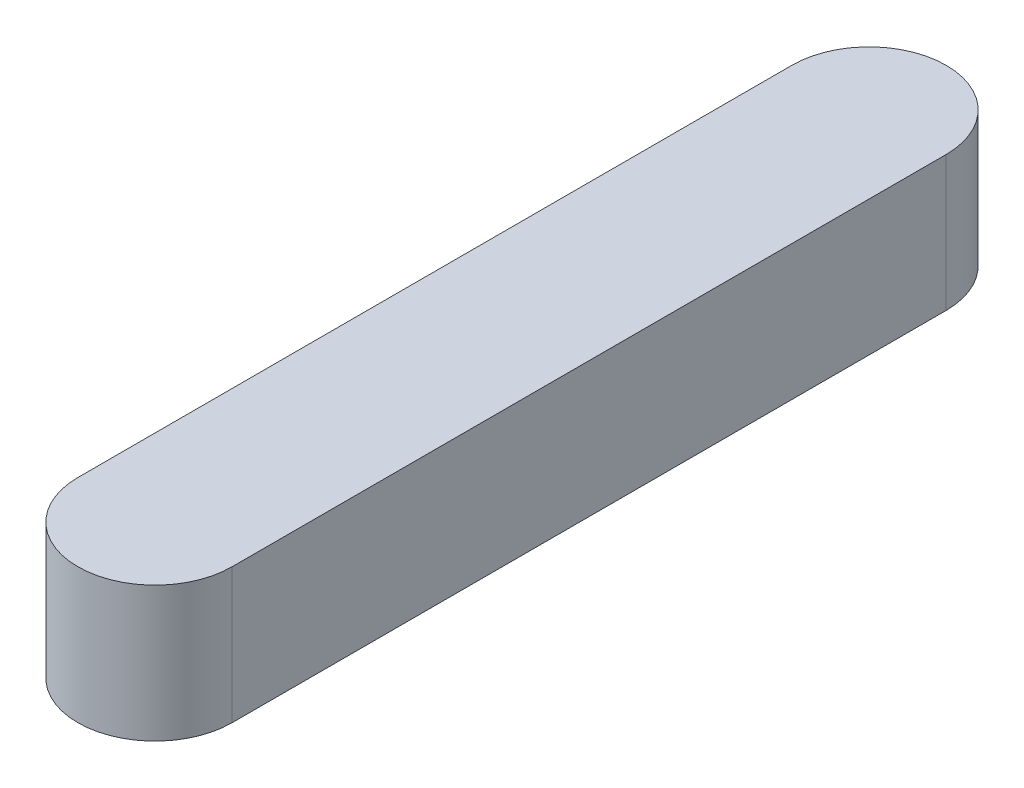
ISO-10303-21;
HEADER;
FILE_DESCRIPTION(('STEP AP214'),'2;1');
FILE_NAME('part.step','',(''),(''),'','','');
FILE_SCHEMA(('AUTOMOTIVE_DESIGN { 1 0 10303 214 1 1 1 1 }'));
ENDSEC;
DATA;
#1=APPLICATION_CONTEXT('core data for automotive mechanical design processes');
#2=APPLICATION_PROTOCOL_DEFINITION('international standard','automotive_design',2000,#1);
#3=PRODUCT_CONTEXT('',#1,'mechanical');
#4=PRODUCT('Part','Part','',(#3));
#5=PRODUCT_RELATED_PRODUCT_CATEGORY('part','',(#4));
#6=PRODUCT_DEFINITION_FORMATION('','',#4);
#7=PRODUCT_DEFINITION_CONTEXT('part definition',#1,'design');
#8=PRODUCT_DEFINITION('design','',#6,#7);
#9=PRODUCT_DEFINITION_SHAPE('','',#8);
#10=(LENGTH_UNIT() NAMED_UNIT(*) SI_UNIT(.MILLI.,.METRE.));
#11=(NAMED_UNIT(*) PLANE_ANGLE_UNIT() SI_UNIT($,.RADIAN.));
#12=(NAMED_UNIT(*) SI_UNIT($,.STERADIAN.) SOLID_ANGLE_UNIT());
#13=UNCERTAINTY_MEASURE_WITH_UNIT(LENGTH_MEASURE(1.E-05),#10,'distance_accuracy_value','');
#14=(GEOMETRIC_REPRESENTATION_CONTEXT(3) GLOBAL_UNCERTAINTY_ASSIGNED_CONTEXT((#13)) GLOBAL_UNIT_ASSIGNED_CONTEXT((#10,
#11,#12)) REPRESENTATION_CONTEXT('',''));
#15=CARTESIAN_POINT('',(0.,0.,0.));
#16=DIRECTION('',(0.,0.,1.));
#17=DIRECTION('',(1.,0.,0.));
#18=AXIS2_PLACEMENT_3D('',#15,#16,#17);
#19=CARTESIAN_POINT('',(0.,3.5,-18.5));
#20=DIRECTION('',(0.,-1.,0.));
#21=DIRECTION('',(0.,0.,-1.));
#22=AXIS2_PLACEMENT_3D('',#19,#20,#21);
#23=CYLINDRICAL_SURFACE('',#22,4.);
#24=CARTESIAN_POINT('',(0.,-3.5,-18.5));
#25=DIRECTION('',(0.,1.,0.));
#26=DIRECTION('',(0.,0.,1.));
#27=AXIS2_PLACEMENT_3D('',#24,#25,#26);
#28=CIRCLE('',#27,4.);
#29=CARTESIAN_POINT('',(4.,-3.5,-18.5));
#30=VERTEX_POINT('',#29);
#31=CARTESIAN_POINT('',(-4.,-3.5,-18.5));
#32=VERTEX_POINT('',#31);
#33=EDGE_CURVE('E72',#30,#32,#28,.T.);
#34=ORIENTED_EDGE('',*,*,#33,.T.);
#35=DIRECTION('',(0.,-1.,0.));
#36=VECTOR('',#35,1.);
#37=CARTESIAN_POINT('',(-4.,3.5,-18.5));
#38=LINE('',#37,#36);
#39=CARTESIAN_POINT('',(-4.,3.5,-18.5));
#40=VERTEX_POINT('',#39);
#41=EDGE_CURVE('E11',#40,#32,#38,.T.);
#42=ORIENTED_EDGE('',*,*,#41,.F.);
#43=CARTESIAN_POINT('',(0.,3.5,-18.5));
#44=DIRECTION('',(0.,1.,0.));
#45=DIRECTION('',(0.,0.,1.));
#46=AXIS2_PLACEMENT_3D('',#43,#44,#45);
#47=CIRCLE('',#46,4.);
#48=CARTESIAN_POINT('',(4.,3.5,-18.5));
#49=VERTEX_POINT('',#48);
#50=EDGE_CURVE('E90',#49,#40,#47,.T.);
#51=ORIENTED_EDGE('',*,*,#50,.F.);
#52=DIRECTION('',(0.,-1.,0.));
#53=VECTOR('',#52,1.);
#54=CARTESIAN_POINT('',(4.,3.5,-18.5));
#55=LINE('',#54,#53);
#56=EDGE_CURVE('E84',#49,#30,#55,.T.);
#57=ORIENTED_EDGE('',*,*,#56,.T.);
#58=EDGE_LOOP('',(#34,#42,#51,#57));
#59=FACE_BOUND('',#58,.T.);
#60=ADVANCED_FACE('F28',(#59),#23,.T.);
#61=CARTESIAN_POINT('',(-4.,3.5,-18.5));
#62=DIRECTION('',(1.,0.,0.));
#63=DIRECTION('',(0.,0.,-1.));
#64=AXIS2_PLACEMENT_3D('',#61,#62,#63);
#65=PLANE('',#64);
#66=DIRECTION('',(0.,0.,1.));
#67=VECTOR('',#66,1.);
#68=CARTESIAN_POINT('',(-4.,-3.5,-18.5));
#69=LINE('',#68,#67);
#70=CARTESIAN_POINT('',(-4.,-3.5,18.5));
#71=VERTEX_POINT('',#70);
#72=EDGE_CURVE('E68',#32,#71,#69,.T.);
#73=ORIENTED_EDGE('',*,*,#72,.T.);
#74=DIRECTION('',(0.,-1.,0.));
#75=VECTOR('',#74,1.);
#76=CARTESIAN_POINT('',(-4.,3.5,18.5));
#77=LINE('',#76,#75);
#78=CARTESIAN_POINT('',(-4.,3.5,18.5));
#79=VERTEX_POINT('',#78);
#80=EDGE_CURVE('E35',#79,#71,#77,.T.);
#81=ORIENTED_EDGE('',*,*,#80,.F.);
#82=DIRECTION('',(0.,0.,1.));
#83=VECTOR('',#82,1.);
#84=CARTESIAN_POINT('',(-4.,3.5,-18.5));
#85=LINE('',#84,#83);
#86=EDGE_CURVE('E80',#40,#79,#85,.T.);
#87=ORIENTED_EDGE('',*,*,#86,.F.);
#88=ORIENTED_EDGE('',*,*,#41,.T.);
#89=EDGE_LOOP('',(#73,#81,#87,#88));
#90=FACE_BOUND('',#89,.T.);
#91=ADVANCED_FACE('F79',(#90),#65,.F.);
#92=CARTESIAN_POINT('',(0.,3.5,18.5));
#93=DIRECTION('',(0.,-1.,0.));
#94=DIRECTION('',(0.,0.,-1.));
#95=AXIS2_PLACEMENT_3D('',#92,#93,#94);
#96=CYLINDRICAL_SURFACE('',#95,4.);
#97=CARTESIAN_POINT('',(0.,-3.5,18.5));
#98=DIRECTION('',(0.,1.,0.));
#99=DIRECTION('',(0.,0.,1.));
#100=AXIS2_PLACEMENT_3D('',#97,#98,#99);
#101=CIRCLE('',#100,4.);
#102=CARTESIAN_POINT('',(4.,-3.5,18.5));
#103=VERTEX_POINT('',#102);
#104=EDGE_CURVE('E73',#71,#103,#101,.T.);
#105=ORIENTED_EDGE('',*,*,#104,.T.);
#106=DIRECTION('',(0.,-1.,0.));
#107=VECTOR('',#106,1.);
#108=CARTESIAN_POINT('',(4.,3.5,18.5));
#109=LINE('',#108,#107);
#110=CARTESIAN_POINT('',(4.,3.5,18.5));
#111=VERTEX_POINT('',#110);
#112=EDGE_CURVE('E96',#111,#103,#109,.T.);
#113=ORIENTED_EDGE('',*,*,#112,.F.);
#114=CARTESIAN_POINT('',(0.,3.5,18.5));
#115=DIRECTION('',(0.,1.,0.));
#116=DIRECTION('',(0.,0.,1.));
#117=AXIS2_PLACEMENT_3D('',#114,#115,#116);
#118=CIRCLE('',#117,4.);
#119=EDGE_CURVE('E47',#79,#111,#118,.T.);
#120=ORIENTED_EDGE('',*,*,#119,.F.);
#121=ORIENTED_EDGE('',*,*,#80,.T.);
#122=EDGE_LOOP('',(#105,#113,#120,#121));
#123=FACE_BOUND('',#122,.T.);
#124=ADVANCED_FACE('F99',(#123),#96,.T.);
#125=CARTESIAN_POINT('',(4.,3.5,18.5));
#126=DIRECTION('',(-1.,0.,0.));
#127=DIRECTION('',(0.,0.,1.));
#128=AXIS2_PLACEMENT_3D('',#125,#126,#127);
#129=PLANE('',#128);
#130=DIRECTION('',(0.,0.,-1.));
#131=VECTOR('',#130,1.);
#132=CARTESIAN_POINT('',(4.,-3.5,18.5));
#133=LINE('',#132,#131);
#134=EDGE_CURVE('E88',#103,#30,#133,.T.);
#135=ORIENTED_EDGE('',*,*,#134,.T.);
#136=ORIENTED_EDGE('',*,*,#56,.F.);
#137=DIRECTION('',(0.,0.,-1.));
#138=VECTOR('',#137,1.);
#139=CARTESIAN_POINT('',(4.,3.5,18.5));
#140=LINE('',#139,#138);
#141=EDGE_CURVE('E42',#111,#49,#140,.T.);
#142=ORIENTED_EDGE('',*,*,#141,.F.);
#143=ORIENTED_EDGE('',*,*,#112,.T.);
#144=EDGE_LOOP('',(#135,#136,#142,#143));
#145=FACE_BOUND('',#144,.T.);
#146=ADVANCED_FACE('F101',(#145),#129,.F.);
#147=CARTESIAN_POINT('',(0.,3.5,-18.5));
#148=DIRECTION('',(0.,1.,0.));
#149=DIRECTION('',(0.,0.,1.));
#150=AXIS2_PLACEMENT_3D('',#147,#148,#149);
#151=PLANE('',#150);
#152=ORIENTED_EDGE('',*,*,#50,.T.);
#153=ORIENTED_EDGE('',*,*,#86,.T.);
#154=ORIENTED_EDGE('',*,*,#119,.T.);
#155=ORIENTED_EDGE('',*,*,#141,.T.);
#156=EDGE_LOOP('',(#152,#153,#154,#155));
#157=FACE_BOUND('',#156,.T.);
#158=ADVANCED_FACE('F102',(#157),#151,.T.);
#159=CARTESIAN_POINT('',(0.,-3.5,-18.5));
#160=DIRECTION('',(0.,1.,0.));
#161=DIRECTION('',(0.,0.,1.));
#162=AXIS2_PLACEMENT_3D('',#159,#160,#161);
#163=PLANE('',#162);
#164=ORIENTED_EDGE('',*,*,#33,.F.);
#165=ORIENTED_EDGE('',*,*,#134,.F.);
#166=ORIENTED_EDGE('',*,*,#104,.F.);
#167=ORIENTED_EDGE('',*,*,#72,.F.);
#168=EDGE_LOOP('',(#164,#165,#166,#167));
#169=FACE_BOUND('',#168,.T.);
#170=ADVANCED_FACE('F69',(#169),#163,.F.);
#171=CLOSED_SHELL('',(#60,#91,#124,#146,#158,#170));
#172=MANIFOLD_SOLID_BREP('B2',#171);
#173=ADVANCED_BREP_SHAPE_REPRESENTATION('',(#18,#172),#14);
#174=SHAPE_DEFINITION_REPRESENTATION(#9,#173);
ENDSEC;
END-ISO-10303-21;
